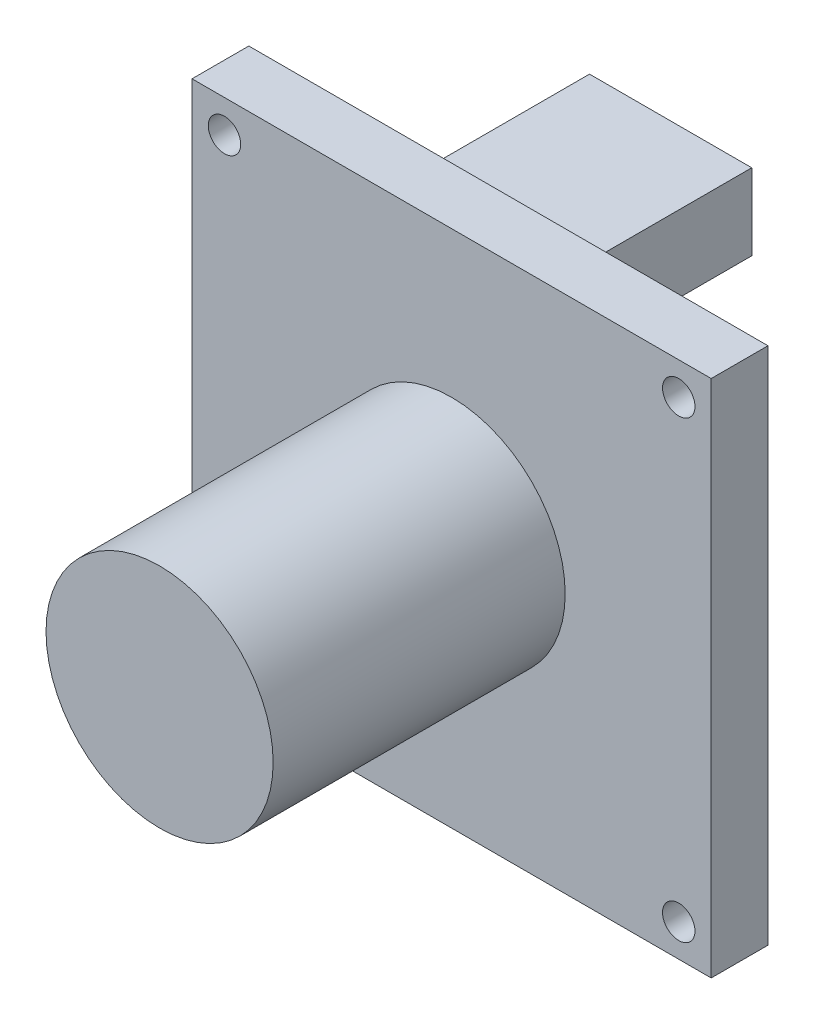
ISO-10303-21;
HEADER;
FILE_DESCRIPTION(('STEP AP214'),'2;1');
FILE_NAME('part.step','',(''),(''),'','','');
FILE_SCHEMA(('AUTOMOTIVE_DESIGN { 1 0 10303 214 1 1 1 1 }'));
ENDSEC;
DATA;
#1=APPLICATION_CONTEXT('core data for automotive mechanical design processes');
#2=APPLICATION_PROTOCOL_DEFINITION('international standard','automotive_design',2000,#1);
#3=PRODUCT_CONTEXT('',#1,'mechanical');
#4=PRODUCT('Part','Part','',(#3));
#5=PRODUCT_RELATED_PRODUCT_CATEGORY('part','',(#4));
#6=PRODUCT_DEFINITION_FORMATION('','',#4);
#7=PRODUCT_DEFINITION_CONTEXT('part definition',#1,'design');
#8=PRODUCT_DEFINITION('design','',#6,#7);
#9=PRODUCT_DEFINITION_SHAPE('','',#8);
#10=(LENGTH_UNIT() NAMED_UNIT(*) SI_UNIT(.MILLI.,.METRE.));
#11=(NAMED_UNIT(*) PLANE_ANGLE_UNIT() SI_UNIT($,.RADIAN.));
#12=(NAMED_UNIT(*) SI_UNIT($,.STERADIAN.) SOLID_ANGLE_UNIT());
#13=UNCERTAINTY_MEASURE_WITH_UNIT(LENGTH_MEASURE(1.E-05),#10,'distance_accuracy_value','');
#14=(GEOMETRIC_REPRESENTATION_CONTEXT(3) GLOBAL_UNCERTAINTY_ASSIGNED_CONTEXT((#13)) GLOBAL_UNIT_ASSIGNED_CONTEXT((#10,
#11,#12)) REPRESENTATION_CONTEXT('',''));
#15=CARTESIAN_POINT('',(0.,0.,0.));
#16=DIRECTION('',(0.,0.,1.));
#17=DIRECTION('',(1.,0.,0.));
#18=AXIS2_PLACEMENT_3D('',#15,#16,#17);
#19=CARTESIAN_POINT('',(16.,-16.,3.5));
#20=DIRECTION('',(-1.,0.,0.));
#21=DIRECTION('',(0.,0.,1.));
#22=AXIS2_PLACEMENT_3D('',#19,#20,#21);
#23=PLANE('',#22);
#24=DIRECTION('',(0.,1.,0.));
#25=VECTOR('',#24,1.);
#26=CARTESIAN_POINT('',(16.,-16.,0.));
#27=LINE('',#26,#25);
#28=CARTESIAN_POINT('',(16.,-16.,0.));
#29=VERTEX_POINT('',#28);
#30=CARTESIAN_POINT('',(16.,16.,0.));
#31=VERTEX_POINT('',#30);
#32=EDGE_CURVE('E141',#29,#31,#27,.T.);
#33=ORIENTED_EDGE('',*,*,#32,.T.);
#34=DIRECTION('',(0.,0.,-1.));
#35=VECTOR('',#34,1.);
#36=CARTESIAN_POINT('',(16.,16.,3.5));
#37=LINE('',#36,#35);
#38=CARTESIAN_POINT('',(16.,16.,3.5));
#39=VERTEX_POINT('',#38);
#40=EDGE_CURVE('E11',#39,#31,#37,.T.);
#41=ORIENTED_EDGE('',*,*,#40,.F.);
#42=DIRECTION('',(0.,1.,0.));
#43=VECTOR('',#42,1.);
#44=CARTESIAN_POINT('',(16.,-16.,3.5));
#45=LINE('',#44,#43);
#46=CARTESIAN_POINT('',(16.,-16.,3.5));
#47=VERTEX_POINT('',#46);
#48=EDGE_CURVE('E144',#47,#39,#45,.T.);
#49=ORIENTED_EDGE('',*,*,#48,.F.);
#50=DIRECTION('',(0.,0.,-1.));
#51=VECTOR('',#50,1.);
#52=CARTESIAN_POINT('',(16.,-16.,3.5));
#53=LINE('',#52,#51);
#54=EDGE_CURVE('E154',#47,#29,#53,.T.);
#55=ORIENTED_EDGE('',*,*,#54,.T.);
#56=EDGE_LOOP('',(#33,#41,#49,#55));
#57=FACE_BOUND('',#56,.T.);
#58=ADVANCED_FACE('F33',(#57),#23,.F.);
#59=CARTESIAN_POINT('',(-16.,16.,3.5));
#60=DIRECTION('',(0.,-1.,0.));
#61=DIRECTION('',(0.,0.,-1.));
#62=AXIS2_PLACEMENT_3D('',#59,#60,#61);
#63=PLANE('',#62);
#64=DIRECTION('',(-1.,0.,0.));
#65=VECTOR('',#64,1.);
#66=CARTESIAN_POINT('',(-16.,16.,0.));
#67=LINE('',#66,#65);
#68=CARTESIAN_POINT('',(-16.,16.,0.));
#69=VERTEX_POINT('',#68);
#70=EDGE_CURVE('E157',#31,#69,#67,.T.);
#71=ORIENTED_EDGE('',*,*,#70,.T.);
#72=DIRECTION('',(0.,0.,-1.));
#73=VECTOR('',#72,1.);
#74=CARTESIAN_POINT('',(-16.,16.,3.5));
#75=LINE('',#74,#73);
#76=CARTESIAN_POINT('',(-16.,16.,3.5));
#77=VERTEX_POINT('',#76);
#78=EDGE_CURVE('E40',#77,#69,#75,.T.);
#79=ORIENTED_EDGE('',*,*,#78,.F.);
#80=DIRECTION('',(-1.,0.,0.));
#81=VECTOR('',#80,1.);
#82=CARTESIAN_POINT('',(-16.,16.,3.5));
#83=LINE('',#82,#81);
#84=EDGE_CURVE('E147',#39,#77,#83,.T.);
#85=ORIENTED_EDGE('',*,*,#84,.F.);
#86=ORIENTED_EDGE('',*,*,#40,.T.);
#87=EDGE_LOOP('',(#71,#79,#85,#86));
#88=FACE_BOUND('',#87,.T.);
#89=ADVANCED_FACE('F187',(#88),#63,.F.);
#90=CARTESIAN_POINT('',(-16.,-16.,3.5));
#91=DIRECTION('',(1.,0.,0.));
#92=DIRECTION('',(0.,0.,-1.));
#93=AXIS2_PLACEMENT_3D('',#90,#91,#92);
#94=PLANE('',#93);
#95=DIRECTION('',(0.,-1.,0.));
#96=VECTOR('',#95,1.);
#97=CARTESIAN_POINT('',(-16.,-16.,0.));
#98=LINE('',#97,#96);
#99=CARTESIAN_POINT('',(-16.,-16.,0.));
#100=VERTEX_POINT('',#99);
#101=EDGE_CURVE('E159',#69,#100,#98,.T.);
#102=ORIENTED_EDGE('',*,*,#101,.T.);
#103=DIRECTION('',(0.,0.,-1.));
#104=VECTOR('',#103,1.);
#105=CARTESIAN_POINT('',(-16.,-16.,3.5));
#106=LINE('',#105,#104);
#107=CARTESIAN_POINT('',(-16.,-16.,3.5));
#108=VERTEX_POINT('',#107);
#109=EDGE_CURVE('E164',#108,#100,#106,.T.);
#110=ORIENTED_EDGE('',*,*,#109,.F.);
#111=DIRECTION('',(0.,-1.,0.));
#112=VECTOR('',#111,1.);
#113=CARTESIAN_POINT('',(-16.,-16.,3.5));
#114=LINE('',#113,#112);
#115=EDGE_CURVE('E150',#77,#108,#114,.T.);
#116=ORIENTED_EDGE('',*,*,#115,.F.);
#117=ORIENTED_EDGE('',*,*,#78,.T.);
#118=EDGE_LOOP('',(#102,#110,#116,#117));
#119=FACE_BOUND('',#118,.T.);
#120=ADVANCED_FACE('F171',(#119),#94,.F.);
#121=CARTESIAN_POINT('',(-16.,-16.,3.5));
#122=DIRECTION('',(0.,1.,0.));
#123=DIRECTION('',(0.,0.,1.));
#124=AXIS2_PLACEMENT_3D('',#121,#122,#123);
#125=PLANE('',#124);
#126=DIRECTION('',(1.,0.,0.));
#127=VECTOR('',#126,1.);
#128=CARTESIAN_POINT('',(-16.,-16.,0.));
#129=LINE('',#128,#127);
#130=EDGE_CURVE('E148',#100,#29,#129,.T.);
#131=ORIENTED_EDGE('',*,*,#130,.T.);
#132=ORIENTED_EDGE('',*,*,#54,.F.);
#133=DIRECTION('',(1.,0.,0.));
#134=VECTOR('',#133,1.);
#135=CARTESIAN_POINT('',(-16.,-16.,3.5));
#136=LINE('',#135,#134);
#137=EDGE_CURVE('E152',#108,#47,#136,.T.);
#138=ORIENTED_EDGE('',*,*,#137,.F.);
#139=ORIENTED_EDGE('',*,*,#109,.T.);
#140=EDGE_LOOP('',(#131,#132,#138,#139));
#141=FACE_BOUND('',#140,.T.);
#142=ADVANCED_FACE('F180',(#141),#125,.F.);
#143=CARTESIAN_POINT('',(0.,0.,3.5));
#144=DIRECTION('',(0.,0.,-1.));
#145=DIRECTION('',(-1.,0.,0.));
#146=AXIS2_PLACEMENT_3D('',#143,#144,#145);
#147=PLANE('',#146);
#148=CARTESIAN_POINT('',(14.,-14.,3.5));
#149=DIRECTION('',(0.,0.,-1.));
#150=DIRECTION('',(-1.,0.,0.));
#151=AXIS2_PLACEMENT_3D('',#148,#149,#150);
#152=CIRCLE('',#151,0.999999999999999);
#153=CARTESIAN_POINT('',(13.,-14.,3.5));
#154=VERTEX_POINT('',#153);
#155=EDGE_CURVE('E124',#154,#154,#152,.F.);
#156=ORIENTED_EDGE('',*,*,#155,.F.);
#157=EDGE_LOOP('',(#156));
#158=FACE_BOUND('',#157,.T.);
#159=CARTESIAN_POINT('',(-14.,14.,3.5));
#160=DIRECTION('',(0.,0.,-1.));
#161=DIRECTION('',(-1.,0.,0.));
#162=AXIS2_PLACEMENT_3D('',#159,#160,#161);
#163=CIRCLE('',#162,0.999999999999999);
#164=CARTESIAN_POINT('',(-15.,14.,3.5));
#165=VERTEX_POINT('',#164);
#166=EDGE_CURVE('E250',#165,#165,#163,.F.);
#167=ORIENTED_EDGE('',*,*,#166,.F.);
#168=EDGE_LOOP('',(#167));
#169=FACE_BOUND('',#168,.T.);
#170=CARTESIAN_POINT('',(-14.,-14.,3.5));
#171=DIRECTION('',(0.,0.,-1.));
#172=DIRECTION('',(-1.,0.,0.));
#173=AXIS2_PLACEMENT_3D('',#170,#171,#172);
#174=CIRCLE('',#173,0.999999999999999);
#175=CARTESIAN_POINT('',(-15.,-14.,3.5));
#176=VERTEX_POINT('',#175);
#177=EDGE_CURVE('E248',#176,#176,#174,.F.);
#178=ORIENTED_EDGE('',*,*,#177,.F.);
#179=EDGE_LOOP('',(#178));
#180=FACE_BOUND('',#179,.T.);
#181=CARTESIAN_POINT('',(14.,14.,3.5));
#182=DIRECTION('',(0.,0.,-1.));
#183=DIRECTION('',(-1.,0.,0.));
#184=AXIS2_PLACEMENT_3D('',#181,#182,#183);
#185=CIRCLE('',#184,0.999999999999999);
#186=CARTESIAN_POINT('',(13.,14.,3.5));
#187=VERTEX_POINT('',#186);
#188=EDGE_CURVE('E251',#187,#187,#185,.F.);
#189=ORIENTED_EDGE('',*,*,#188,.F.);
#190=EDGE_LOOP('',(#189));
#191=FACE_BOUND('',#190,.T.);
#192=CARTESIAN_POINT('',(0.,0.,3.5));
#193=DIRECTION('',(0.,0.,-1.));
#194=DIRECTION('',(-1.,0.,0.));
#195=AXIS2_PLACEMENT_3D('',#192,#193,#194);
#196=CIRCLE('',#195,7.);
#197=CARTESIAN_POINT('',(-7.,0.,3.5));
#198=VERTEX_POINT('',#197);
#199=EDGE_CURVE('E134',#198,#198,#196,.T.);
#200=ORIENTED_EDGE('',*,*,#199,.T.);
#201=EDGE_LOOP('',(#200));
#202=FACE_BOUND('',#201,.T.);
#203=ORIENTED_EDGE('',*,*,#48,.T.);
#204=ORIENTED_EDGE('',*,*,#84,.T.);
#205=ORIENTED_EDGE('',*,*,#115,.T.);
#206=ORIENTED_EDGE('',*,*,#137,.T.);
#207=EDGE_LOOP('',(#203,#204,#205,#206));
#208=FACE_BOUND('',#207,.T.);
#209=ADVANCED_FACE('F186',(#158,#169,#180,#191,#202,#208),#147,.F.);
#210=CARTESIAN_POINT('',(0.,0.,0.));
#211=DIRECTION('',(0.,0.,-1.));
#212=DIRECTION('',(-1.,0.,0.));
#213=AXIS2_PLACEMENT_3D('',#210,#211,#212);
#214=PLANE('',#213);
#215=CARTESIAN_POINT('',(14.,-14.,0.));
#216=DIRECTION('',(0.,0.,1.));
#217=DIRECTION('',(1.,0.,0.));
#218=AXIS2_PLACEMENT_3D('',#215,#216,#217);
#219=CIRCLE('',#218,0.999999999999999);
#220=CARTESIAN_POINT('',(15.,-14.,0.));
#221=VERTEX_POINT('',#220);
#222=EDGE_CURVE('E260',#221,#221,#219,.T.);
#223=ORIENTED_EDGE('',*,*,#222,.T.);
#224=EDGE_LOOP('',(#223));
#225=FACE_BOUND('',#224,.T.);
#226=CARTESIAN_POINT('',(-14.,14.,0.));
#227=DIRECTION('',(0.,0.,1.));
#228=DIRECTION('',(1.,0.,0.));
#229=AXIS2_PLACEMENT_3D('',#226,#227,#228);
#230=CIRCLE('',#229,0.999999999999999);
#231=CARTESIAN_POINT('',(-13.,14.,0.));
#232=VERTEX_POINT('',#231);
#233=EDGE_CURVE('E263',#232,#232,#230,.T.);
#234=ORIENTED_EDGE('',*,*,#233,.T.);
#235=EDGE_LOOP('',(#234));
#236=FACE_BOUND('',#235,.T.);
#237=CARTESIAN_POINT('',(-14.,-14.,0.));
#238=DIRECTION('',(0.,0.,1.));
#239=DIRECTION('',(1.,0.,0.));
#240=AXIS2_PLACEMENT_3D('',#237,#238,#239);
#241=CIRCLE('',#240,0.999999999999999);
#242=CARTESIAN_POINT('',(-13.,-14.,0.));
#243=VERTEX_POINT('',#242);
#244=EDGE_CURVE('E245',#243,#243,#241,.T.);
#245=ORIENTED_EDGE('',*,*,#244,.T.);
#246=EDGE_LOOP('',(#245));
#247=FACE_BOUND('',#246,.T.);
#248=CARTESIAN_POINT('',(14.,14.,0.));
#249=DIRECTION('',(0.,0.,1.));
#250=DIRECTION('',(1.,0.,0.));
#251=AXIS2_PLACEMENT_3D('',#248,#249,#250);
#252=CIRCLE('',#251,0.999999999999999);
#253=CARTESIAN_POINT('',(15.,14.,0.));
#254=VERTEX_POINT('',#253);
#255=EDGE_CURVE('E255',#254,#254,#252,.T.);
#256=ORIENTED_EDGE('',*,*,#255,.T.);
#257=EDGE_LOOP('',(#256));
#258=FACE_BOUND('',#257,.T.);
#259=DIRECTION('',(-1.,0.,0.));
#260=VECTOR('',#259,1.);
#261=CARTESIAN_POINT('',(0.,15.,0.));
#262=LINE('',#261,#260);
#263=CARTESIAN_POINT('',(5.,15.,0.));
#264=VERTEX_POINT('',#263);
#265=CARTESIAN_POINT('',(-5.,15.,0.));
#266=VERTEX_POINT('',#265);
#267=EDGE_CURVE('E129',#264,#266,#262,.T.);
#268=ORIENTED_EDGE('',*,*,#267,.T.);
#269=DIRECTION('',(0.,-1.,0.));
#270=VECTOR('',#269,1.);
#271=CARTESIAN_POINT('',(-5.,0.,0.));
#272=LINE('',#271,#270);
#273=CARTESIAN_POINT('',(-5.,10.3,0.));
#274=VERTEX_POINT('',#273);
#275=EDGE_CURVE('E102',#266,#274,#272,.T.);
#276=ORIENTED_EDGE('',*,*,#275,.T.);
#277=DIRECTION('',(1.,0.,0.));
#278=VECTOR('',#277,1.);
#279=CARTESIAN_POINT('',(0.,10.3,0.));
#280=LINE('',#279,#278);
#281=CARTESIAN_POINT('',(5.,10.3,0.));
#282=VERTEX_POINT('',#281);
#283=EDGE_CURVE('E52',#274,#282,#280,.T.);
#284=ORIENTED_EDGE('',*,*,#283,.T.);
#285=DIRECTION('',(0.,1.,0.));
#286=VECTOR('',#285,1.);
#287=CARTESIAN_POINT('',(5.,0.,0.));
#288=LINE('',#287,#286);
#289=EDGE_CURVE('E47',#282,#264,#288,.T.);
#290=ORIENTED_EDGE('',*,*,#289,.T.);
#291=EDGE_LOOP('',(#268,#276,#284,#290));
#292=FACE_BOUND('',#291,.T.);
#293=ORIENTED_EDGE('',*,*,#32,.F.);
#294=ORIENTED_EDGE('',*,*,#130,.F.);
#295=ORIENTED_EDGE('',*,*,#101,.F.);
#296=ORIENTED_EDGE('',*,*,#70,.F.);
#297=EDGE_LOOP('',(#293,#294,#295,#296));
#298=FACE_BOUND('',#297,.T.);
#299=ADVANCED_FACE('F177',(#225,#236,#247,#258,#292,#298),#214,.T.);
#300=CARTESIAN_POINT('',(0.,0.,21.5));
#301=DIRECTION('',(0.,0.,-1.));
#302=DIRECTION('',(-1.,0.,0.));
#303=AXIS2_PLACEMENT_3D('',#300,#301,#302);
#304=CYLINDRICAL_SURFACE('',#303,7.);
#305=CARTESIAN_POINT('',(0.,0.,21.5));
#306=DIRECTION('',(0.,0.,-1.));
#307=DIRECTION('',(-1.,0.,0.));
#308=AXIS2_PLACEMENT_3D('',#305,#306,#307);
#309=CIRCLE('',#308,7.);
#310=CARTESIAN_POINT('',(-7.,0.,21.5));
#311=VERTEX_POINT('',#310);
#312=EDGE_CURVE('E138',#311,#311,#309,.T.);
#313=ORIENTED_EDGE('',*,*,#312,.T.);
#314=EDGE_LOOP('',(#313));
#315=FACE_BOUND('',#314,.T.);
#316=ORIENTED_EDGE('',*,*,#199,.F.);
#317=EDGE_LOOP('',(#316));
#318=FACE_BOUND('',#317,.T.);
#319=ADVANCED_FACE('F199',(#315,#318),#304,.T.);
#320=CARTESIAN_POINT('',(0.,0.,21.5));
#321=DIRECTION('',(0.,0.,-1.));
#322=DIRECTION('',(-1.,0.,0.));
#323=AXIS2_PLACEMENT_3D('',#320,#321,#322);
#324=PLANE('',#323);
#325=ORIENTED_EDGE('',*,*,#312,.F.);
#326=EDGE_LOOP('',(#325));
#327=FACE_BOUND('',#326,.T.);
#328=ADVANCED_FACE('F206',(#327),#324,.F.);
#329=CARTESIAN_POINT('',(0.,15.,-10.));
#330=DIRECTION('',(0.,1.,0.));
#331=DIRECTION('',(0.,0.,1.));
#332=AXIS2_PLACEMENT_3D('',#329,#330,#331);
#333=PLANE('',#332);
#334=ORIENTED_EDGE('',*,*,#267,.F.);
#335=DIRECTION('',(0.,0.,1.));
#336=VECTOR('',#335,1.);
#337=CARTESIAN_POINT('',(5.,15.,-10.));
#338=LINE('',#337,#336);
#339=CARTESIAN_POINT('',(5.,15.,-10.));
#340=VERTEX_POINT('',#339);
#341=EDGE_CURVE('E120',#340,#264,#338,.T.);
#342=ORIENTED_EDGE('',*,*,#341,.F.);
#343=DIRECTION('',(-1.,0.,0.));
#344=VECTOR('',#343,1.);
#345=CARTESIAN_POINT('',(0.,15.,-10.));
#346=LINE('',#345,#344);
#347=CARTESIAN_POINT('',(-5.,15.,-10.));
#348=VERTEX_POINT('',#347);
#349=EDGE_CURVE('E114',#340,#348,#346,.T.);
#350=ORIENTED_EDGE('',*,*,#349,.T.);
#351=DIRECTION('',(0.,0.,1.));
#352=VECTOR('',#351,1.);
#353=CARTESIAN_POINT('',(-5.,15.,-10.));
#354=LINE('',#353,#352);
#355=EDGE_CURVE('E97',#348,#266,#354,.T.);
#356=ORIENTED_EDGE('',*,*,#355,.T.);
#357=EDGE_LOOP('',(#334,#342,#350,#356));
#358=FACE_BOUND('',#357,.T.);
#359=ADVANCED_FACE('F119',(#358),#333,.T.);
#360=CARTESIAN_POINT('',(5.,0.,-10.));
#361=DIRECTION('',(1.,0.,0.));
#362=DIRECTION('',(0.,0.,-1.));
#363=AXIS2_PLACEMENT_3D('',#360,#361,#362);
#364=PLANE('',#363);
#365=ORIENTED_EDGE('',*,*,#289,.F.);
#366=DIRECTION('',(0.,0.,1.));
#367=VECTOR('',#366,1.);
#368=CARTESIAN_POINT('',(5.,10.3,-10.));
#369=LINE('',#368,#367);
#370=CARTESIAN_POINT('',(5.,10.3,-10.));
#371=VERTEX_POINT('',#370);
#372=EDGE_CURVE('E135',#371,#282,#369,.T.);
#373=ORIENTED_EDGE('',*,*,#372,.F.);
#374=DIRECTION('',(0.,1.,0.));
#375=VECTOR('',#374,1.);
#376=CARTESIAN_POINT('',(5.,0.,-10.));
#377=LINE('',#376,#375);
#378=EDGE_CURVE('E107',#371,#340,#377,.T.);
#379=ORIENTED_EDGE('',*,*,#378,.T.);
#380=ORIENTED_EDGE('',*,*,#341,.T.);
#381=EDGE_LOOP('',(#365,#373,#379,#380));
#382=FACE_BOUND('',#381,.T.);
#383=ADVANCED_FACE('F213',(#382),#364,.T.);
#384=CARTESIAN_POINT('',(0.,10.3,-10.));
#385=DIRECTION('',(0.,-1.,0.));
#386=DIRECTION('',(0.,0.,-1.));
#387=AXIS2_PLACEMENT_3D('',#384,#385,#386);
#388=PLANE('',#387);
#389=ORIENTED_EDGE('',*,*,#283,.F.);
#390=DIRECTION('',(0.,0.,1.));
#391=VECTOR('',#390,1.);
#392=CARTESIAN_POINT('',(-5.,10.3,-10.));
#393=LINE('',#392,#391);
#394=CARTESIAN_POINT('',(-5.,10.3,-10.));
#395=VERTEX_POINT('',#394);
#396=EDGE_CURVE('E106',#395,#274,#393,.T.);
#397=ORIENTED_EDGE('',*,*,#396,.F.);
#398=DIRECTION('',(1.,0.,0.));
#399=VECTOR('',#398,1.);
#400=CARTESIAN_POINT('',(0.,10.3,-10.));
#401=LINE('',#400,#399);
#402=EDGE_CURVE('E117',#395,#371,#401,.T.);
#403=ORIENTED_EDGE('',*,*,#402,.T.);
#404=ORIENTED_EDGE('',*,*,#372,.T.);
#405=EDGE_LOOP('',(#389,#397,#403,#404));
#406=FACE_BOUND('',#405,.T.);
#407=ADVANCED_FACE('F216',(#406),#388,.T.);
#408=CARTESIAN_POINT('',(-5.,0.,-10.));
#409=DIRECTION('',(-1.,0.,0.));
#410=DIRECTION('',(0.,0.,1.));
#411=AXIS2_PLACEMENT_3D('',#408,#409,#410);
#412=PLANE('',#411);
#413=ORIENTED_EDGE('',*,*,#275,.F.);
#414=ORIENTED_EDGE('',*,*,#355,.F.);
#415=DIRECTION('',(0.,-1.,0.));
#416=VECTOR('',#415,1.);
#417=CARTESIAN_POINT('',(-5.,0.,-10.));
#418=LINE('',#417,#416);
#419=EDGE_CURVE('E101',#348,#395,#418,.T.);
#420=ORIENTED_EDGE('',*,*,#419,.T.);
#421=ORIENTED_EDGE('',*,*,#396,.T.);
#422=EDGE_LOOP('',(#413,#414,#420,#421));
#423=FACE_BOUND('',#422,.T.);
#424=ADVANCED_FACE('F99',(#423),#412,.T.);
#425=CARTESIAN_POINT('',(0.,0.,-10.));
#426=DIRECTION('',(0.,0.,1.));
#427=DIRECTION('',(1.,0.,0.));
#428=AXIS2_PLACEMENT_3D('',#425,#426,#427);
#429=PLANE('',#428);
#430=ORIENTED_EDGE('',*,*,#349,.F.);
#431=ORIENTED_EDGE('',*,*,#378,.F.);
#432=ORIENTED_EDGE('',*,*,#402,.F.);
#433=ORIENTED_EDGE('',*,*,#419,.F.);
#434=EDGE_LOOP('',(#430,#431,#432,#433));
#435=FACE_BOUND('',#434,.T.);
#436=ADVANCED_FACE('F112',(#435),#429,.F.);
#437=CARTESIAN_POINT('',(14.,14.,10.));
#438=DIRECTION('',(0.,0.,-1.));
#439=DIRECTION('',(-1.,0.,0.));
#440=AXIS2_PLACEMENT_3D('',#437,#438,#439);
#441=CYLINDRICAL_SURFACE('',#440,0.999999999999999);
#442=ORIENTED_EDGE('',*,*,#255,.F.);
#443=EDGE_LOOP('',(#442));
#444=FACE_BOUND('',#443,.T.);
#445=ORIENTED_EDGE('',*,*,#188,.T.);
#446=EDGE_LOOP('',(#445));
#447=FACE_BOUND('',#446,.T.);
#448=ADVANCED_FACE('F225',(#444,#447),#441,.F.);
#449=CARTESIAN_POINT('',(-14.,-14.,10.));
#450=DIRECTION('',(0.,0.,-1.));
#451=DIRECTION('',(-1.,0.,0.));
#452=AXIS2_PLACEMENT_3D('',#449,#450,#451);
#453=CYLINDRICAL_SURFACE('',#452,0.999999999999999);
#454=ORIENTED_EDGE('',*,*,#244,.F.);
#455=EDGE_LOOP('',(#454));
#456=FACE_BOUND('',#455,.T.);
#457=ORIENTED_EDGE('',*,*,#177,.T.);
#458=EDGE_LOOP('',(#457));
#459=FACE_BOUND('',#458,.T.);
#460=ADVANCED_FACE('F228',(#456,#459),#453,.F.);
#461=CARTESIAN_POINT('',(-14.,14.,10.));
#462=DIRECTION('',(0.,0.,-1.));
#463=DIRECTION('',(-1.,0.,0.));
#464=AXIS2_PLACEMENT_3D('',#461,#462,#463);
#465=CYLINDRICAL_SURFACE('',#464,0.999999999999999);
#466=ORIENTED_EDGE('',*,*,#233,.F.);
#467=EDGE_LOOP('',(#466));
#468=FACE_BOUND('',#467,.T.);
#469=ORIENTED_EDGE('',*,*,#166,.T.);
#470=EDGE_LOOP('',(#469));
#471=FACE_BOUND('',#470,.T.);
#472=ADVANCED_FACE('F233',(#468,#471),#465,.F.);
#473=CARTESIAN_POINT('',(14.,-14.,10.));
#474=DIRECTION('',(0.,0.,-1.));
#475=DIRECTION('',(-1.,0.,0.));
#476=AXIS2_PLACEMENT_3D('',#473,#474,#475);
#477=CYLINDRICAL_SURFACE('',#476,0.999999999999999);
#478=ORIENTED_EDGE('',*,*,#222,.F.);
#479=EDGE_LOOP('',(#478));
#480=FACE_BOUND('',#479,.T.);
#481=ORIENTED_EDGE('',*,*,#155,.T.);
#482=EDGE_LOOP('',(#481));
#483=FACE_BOUND('',#482,.T.);
#484=ADVANCED_FACE('F230',(#480,#483),#477,.F.);
#485=CLOSED_SHELL('',(#58,#89,#120,#142,#209,#299,#319,#328,#359,#383,#407,#424,#436,#448,#460,
#472,#484));
#486=MANIFOLD_SOLID_BREP('B2',#485);
#487=ADVANCED_BREP_SHAPE_REPRESENTATION('',(#18,#486),#14);
#488=SHAPE_DEFINITION_REPRESENTATION(#9,#487);
ENDSEC;
END-ISO-10303-21;
